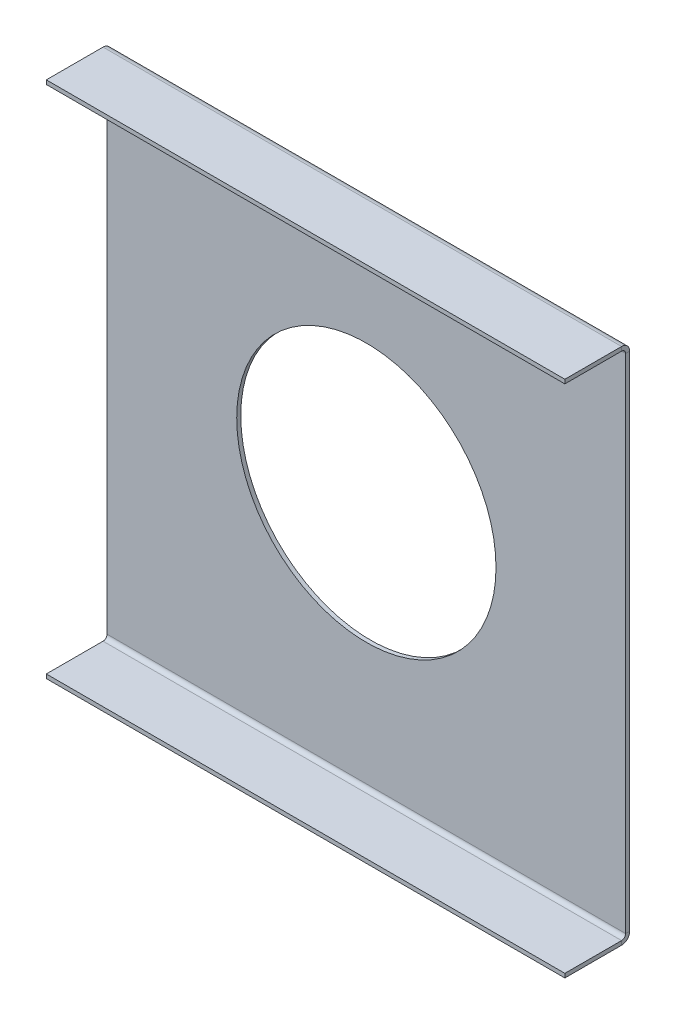
ISO-10303-21;
HEADER;
FILE_DESCRIPTION(('STEP AP214'),'2;1');
FILE_NAME('part.step','',(''),(''),'','','');
FILE_SCHEMA(('AUTOMOTIVE_DESIGN { 1 0 10303 214 1 1 1 1 }'));
ENDSEC;
DATA;
#1=APPLICATION_CONTEXT('core data for automotive mechanical design processes');
#2=APPLICATION_PROTOCOL_DEFINITION('international standard','automotive_design',2000,#1);
#3=PRODUCT_CONTEXT('',#1,'mechanical');
#4=PRODUCT('Part','Part','',(#3));
#5=PRODUCT_RELATED_PRODUCT_CATEGORY('part','',(#4));
#6=PRODUCT_DEFINITION_FORMATION('','',#4);
#7=PRODUCT_DEFINITION_CONTEXT('part definition',#1,'design');
#8=PRODUCT_DEFINITION('design','',#6,#7);
#9=PRODUCT_DEFINITION_SHAPE('','',#8);
#10=(LENGTH_UNIT() NAMED_UNIT(*) SI_UNIT(.MILLI.,.METRE.));
#11=(NAMED_UNIT(*) PLANE_ANGLE_UNIT() SI_UNIT($,.RADIAN.));
#12=(NAMED_UNIT(*) SI_UNIT($,.STERADIAN.) SOLID_ANGLE_UNIT());
#13=UNCERTAINTY_MEASURE_WITH_UNIT(LENGTH_MEASURE(1.E-05),#10,'distance_accuracy_value','');
#14=(GEOMETRIC_REPRESENTATION_CONTEXT(3) GLOBAL_UNCERTAINTY_ASSIGNED_CONTEXT((#13)) GLOBAL_UNIT_ASSIGNED_CONTEXT((#10,
#11,#12)) REPRESENTATION_CONTEXT('',''));
#15=CARTESIAN_POINT('',(0.,0.,0.));
#16=DIRECTION('',(0.,0.,1.));
#17=DIRECTION('',(1.,0.,0.));
#18=AXIS2_PLACEMENT_3D('',#15,#16,#17);
#19=CARTESIAN_POINT('',(0.,0.,0.));
#20=DIRECTION('',(0.,0.,1.));
#21=DIRECTION('',(1.,0.,0.));
#22=AXIS2_PLACEMENT_3D('',#19,#20,#21);
#23=PLANE('',#22);
#24=CARTESIAN_POINT('',(101.6,101.975799724417,0.));
#25=DIRECTION('',(0.,0.,-1.));
#26=DIRECTION('',(-1.,0.,0.));
#27=AXIS2_PLACEMENT_3D('',#24,#25,#26);
#28=CIRCLE('',#27,50.8);
#29=CARTESIAN_POINT('',(50.8,101.975799724417,0.));
#30=VERTEX_POINT('',#29);
#31=EDGE_CURVE('E341',#30,#30,#28,.T.);
#32=ORIENTED_EDGE('',*,*,#31,.F.);
#33=EDGE_LOOP('',(#32));
#34=FACE_BOUND('',#33,.T.);
#35=DIRECTION('',(1.,0.,0.));
#36=VECTOR('',#35,1.);
#37=CARTESIAN_POINT('',(203.2,3.17499999999999,0.));
#38=LINE('',#37,#36);
#39=CARTESIAN_POINT('',(203.2,3.17499999999999,0.));
#40=VERTEX_POINT('',#39);
#41=CARTESIAN_POINT('',(0.,3.17500000000001,0.));
#42=VERTEX_POINT('',#41);
#43=EDGE_CURVE('E230',#40,#42,#38,.F.);
#44=ORIENTED_EDGE('',*,*,#43,.T.);
#45=DIRECTION('',(0.,1.,0.));
#46=VECTOR('',#45,1.);
#47=CARTESIAN_POINT('',(0.,0.,0.));
#48=LINE('',#47,#46);
#49=CARTESIAN_POINT('',(0.,200.025,0.));
#50=VERTEX_POINT('',#49);
#51=EDGE_CURVE('E97',#42,#50,#48,.T.);
#52=ORIENTED_EDGE('',*,*,#51,.T.);
#53=DIRECTION('',(-1.,0.,0.));
#54=VECTOR('',#53,1.);
#55=CARTESIAN_POINT('',(0.,200.025,0.));
#56=LINE('',#55,#54);
#57=CARTESIAN_POINT('',(203.2,200.025,0.));
#58=VERTEX_POINT('',#57);
#59=EDGE_CURVE('E303',#50,#58,#56,.F.);
#60=ORIENTED_EDGE('',*,*,#59,.T.);
#61=DIRECTION('',(0.,1.,0.));
#62=VECTOR('',#61,1.);
#63=CARTESIAN_POINT('',(203.2,0.,0.));
#64=LINE('',#63,#62);
#65=EDGE_CURVE('E13',#40,#58,#64,.T.);
#66=ORIENTED_EDGE('',*,*,#65,.F.);
#67=EDGE_LOOP('',(#44,#52,#60,#66));
#68=FACE_BOUND('',#67,.T.);
#69=ADVANCED_FACE('F87',(#34,#68),#23,.F.);
#70=CARTESIAN_POINT('',(0.,0.,1.5875));
#71=DIRECTION('',(0.,0.,1.));
#72=DIRECTION('',(1.,0.,0.));
#73=AXIS2_PLACEMENT_3D('',#70,#71,#72);
#74=PLANE('',#73);
#75=CARTESIAN_POINT('',(101.6,101.975799724417,1.5875));
#76=DIRECTION('',(0.,0.,1.));
#77=DIRECTION('',(1.,0.,0.));
#78=AXIS2_PLACEMENT_3D('',#75,#76,#77);
#79=CIRCLE('',#78,50.8);
#80=CARTESIAN_POINT('',(152.4,101.975799724417,1.5875));
#81=VERTEX_POINT('',#80);
#82=EDGE_CURVE('E91',#81,#81,#79,.T.);
#83=ORIENTED_EDGE('',*,*,#82,.F.);
#84=EDGE_LOOP('',(#83));
#85=FACE_BOUND('',#84,.T.);
#86=DIRECTION('',(0.,1.,0.));
#87=VECTOR('',#86,1.);
#88=CARTESIAN_POINT('',(0.,0.,1.5875));
#89=LINE('',#88,#87);
#90=CARTESIAN_POINT('',(0.,3.17499999999999,1.5875));
#91=VERTEX_POINT('',#90);
#92=CARTESIAN_POINT('',(0.,200.025,1.5875));
#93=VERTEX_POINT('',#92);
#94=EDGE_CURVE('E105',#91,#93,#89,.T.);
#95=ORIENTED_EDGE('',*,*,#94,.F.);
#96=DIRECTION('',(1.,0.,0.));
#97=VECTOR('',#96,1.);
#98=CARTESIAN_POINT('',(203.2,3.17499999999999,1.5875));
#99=LINE('',#98,#97);
#100=CARTESIAN_POINT('',(203.2,3.17499999999999,1.5875));
#101=VERTEX_POINT('',#100);
#102=EDGE_CURVE('E246',#101,#91,#99,.F.);
#103=ORIENTED_EDGE('',*,*,#102,.F.);
#104=DIRECTION('',(0.,1.,0.));
#105=VECTOR('',#104,1.);
#106=CARTESIAN_POINT('',(203.2,0.,1.5875));
#107=LINE('',#106,#105);
#108=CARTESIAN_POINT('',(203.2,200.025,1.5875));
#109=VERTEX_POINT('',#108);
#110=EDGE_CURVE('E334',#101,#109,#107,.T.);
#111=ORIENTED_EDGE('',*,*,#110,.T.);
#112=DIRECTION('',(-1.,0.,0.));
#113=VECTOR('',#112,1.);
#114=CARTESIAN_POINT('',(0.,200.025,1.5875));
#115=LINE('',#114,#113);
#116=EDGE_CURVE('E319',#93,#109,#115,.F.);
#117=ORIENTED_EDGE('',*,*,#116,.F.);
#118=EDGE_LOOP('',(#95,#103,#111,#117));
#119=FACE_BOUND('',#118,.T.);
#120=ADVANCED_FACE('F352',(#85,#119),#74,.T.);
#121=CARTESIAN_POINT('',(203.2,0.,0.));
#122=DIRECTION('',(1.,0.,0.));
#123=DIRECTION('',(0.,1.,0.));
#124=AXIS2_PLACEMENT_3D('',#121,#122,#123);
#125=PLANE('',#124);
#126=ORIENTED_EDGE('',*,*,#110,.F.);
#127=DIRECTION('',(0.,0.,-1.));
#128=VECTOR('',#127,1.);
#129=CARTESIAN_POINT('',(203.2,3.17499999999999,1.5875));
#130=LINE('',#129,#128);
#131=EDGE_CURVE('E238',#101,#40,#130,.T.);
#132=ORIENTED_EDGE('',*,*,#131,.T.);
#133=ORIENTED_EDGE('',*,*,#65,.T.);
#134=DIRECTION('',(0.,0.,-1.));
#135=VECTOR('',#134,1.);
#136=CARTESIAN_POINT('',(203.2,200.025,1.5875));
#137=LINE('',#136,#135);
#138=EDGE_CURVE('E326',#109,#58,#137,.T.);
#139=ORIENTED_EDGE('',*,*,#138,.F.);
#140=EDGE_LOOP('',(#126,#132,#133,#139));
#141=FACE_BOUND('',#140,.T.);
#142=ADVANCED_FACE('F355',(#141),#125,.T.);
#143=CARTESIAN_POINT('',(0.,0.,0.));
#144=DIRECTION('',(1.,0.,0.));
#145=DIRECTION('',(0.,1.,0.));
#146=AXIS2_PLACEMENT_3D('',#143,#144,#145);
#147=PLANE('',#146);
#148=DIRECTION('',(0.,0.,-1.));
#149=VECTOR('',#148,1.);
#150=CARTESIAN_POINT('',(0.,3.17499999999999,1.5875));
#151=LINE('',#150,#149);
#152=EDGE_CURVE('E254',#91,#42,#151,.T.);
#153=ORIENTED_EDGE('',*,*,#152,.F.);
#154=ORIENTED_EDGE('',*,*,#94,.T.);
#155=DIRECTION('',(0.,0.,-1.));
#156=VECTOR('',#155,1.);
#157=CARTESIAN_POINT('',(0.,200.025,1.5875));
#158=LINE('',#157,#156);
#159=EDGE_CURVE('E311',#93,#50,#158,.T.);
#160=ORIENTED_EDGE('',*,*,#159,.T.);
#161=ORIENTED_EDGE('',*,*,#51,.F.);
#162=EDGE_LOOP('',(#153,#154,#160,#161));
#163=FACE_BOUND('',#162,.T.);
#164=ADVANCED_FACE('F89',(#163),#147,.F.);
#165=CARTESIAN_POINT('',(203.2,200.025,3.17499999999999));
#166=DIRECTION('',(1.,0.,0.));
#167=DIRECTION('',(0.,0.,-1.));
#168=AXIS2_PLACEMENT_3D('',#165,#166,#167);
#169=PLANE('',#168);
#170=DIRECTION('',(0.,-1.,0.));
#171=VECTOR('',#170,1.);
#172=CARTESIAN_POINT('',(203.2,203.2,3.17499999999998));
#173=LINE('',#172,#171);
#174=CARTESIAN_POINT('',(203.2,201.6125,3.17499999999998));
#175=VERTEX_POINT('',#174);
#176=CARTESIAN_POINT('',(203.2,203.2,3.17499999999998));
#177=VERTEX_POINT('',#176);
#178=EDGE_CURVE('E258',#175,#177,#173,.F.);
#179=ORIENTED_EDGE('',*,*,#178,.F.);
#180=CARTESIAN_POINT('',(203.2,200.025,3.17499999999999));
#181=DIRECTION('',(-1.,0.,0.));
#182=DIRECTION('',(0.,0.,1.));
#183=AXIS2_PLACEMENT_3D('',#180,#181,#182);
#184=CIRCLE('',#183,1.58749999999999);
#185=EDGE_CURVE('E315',#109,#175,#184,.F.);
#186=ORIENTED_EDGE('',*,*,#185,.F.);
#187=ORIENTED_EDGE('',*,*,#138,.T.);
#188=CARTESIAN_POINT('',(203.2,200.025,3.17499999999999));
#189=DIRECTION('',(-1.,0.,0.));
#190=DIRECTION('',(0.,0.,1.));
#191=AXIS2_PLACEMENT_3D('',#188,#189,#190);
#192=CIRCLE('',#191,3.17499999999999);
#193=EDGE_CURVE('E306',#58,#177,#192,.F.);
#194=ORIENTED_EDGE('',*,*,#193,.T.);
#195=EDGE_LOOP('',(#179,#186,#187,#194));
#196=FACE_BOUND('',#195,.T.);
#197=ADVANCED_FACE('F386',(#196),#169,.T.);
#198=CARTESIAN_POINT('',(0.,200.025,3.17499999999999));
#199=DIRECTION('',(1.,0.,0.));
#200=DIRECTION('',(0.,0.,-1.));
#201=AXIS2_PLACEMENT_3D('',#198,#199,#200);
#202=PLANE('',#201);
#203=CARTESIAN_POINT('',(0.,200.025,3.17499999999999));
#204=DIRECTION('',(-1.,0.,0.));
#205=DIRECTION('',(0.,0.,1.));
#206=AXIS2_PLACEMENT_3D('',#203,#204,#205);
#207=CIRCLE('',#206,1.58749999999999);
#208=CARTESIAN_POINT('',(0.,201.6125,3.17499999999998));
#209=VERTEX_POINT('',#208);
#210=EDGE_CURVE('E265',#209,#93,#207,.T.);
#211=ORIENTED_EDGE('',*,*,#210,.F.);
#212=DIRECTION('',(0.,-1.,0.));
#213=VECTOR('',#212,1.);
#214=CARTESIAN_POINT('',(0.,201.6125,3.17499999999998));
#215=LINE('',#214,#213);
#216=CARTESIAN_POINT('',(0.,203.2,3.17499999999998));
#217=VERTEX_POINT('',#216);
#218=EDGE_CURVE('E293',#209,#217,#215,.F.);
#219=ORIENTED_EDGE('',*,*,#218,.T.);
#220=CARTESIAN_POINT('',(0.,200.025,3.17499999999999));
#221=DIRECTION('',(-1.,0.,0.));
#222=DIRECTION('',(0.,0.,1.));
#223=AXIS2_PLACEMENT_3D('',#220,#221,#222);
#224=CIRCLE('',#223,3.17499999999999);
#225=EDGE_CURVE('E307',#217,#50,#224,.T.);
#226=ORIENTED_EDGE('',*,*,#225,.T.);
#227=ORIENTED_EDGE('',*,*,#159,.F.);
#228=EDGE_LOOP('',(#211,#219,#226,#227));
#229=FACE_BOUND('',#228,.T.);
#230=ADVANCED_FACE('F406',(#229),#202,.F.);
#231=CARTESIAN_POINT('',(0.,200.025,3.17499999999999));
#232=DIRECTION('',(-1.,0.,0.));
#233=DIRECTION('',(0.,1.,0.));
#234=AXIS2_PLACEMENT_3D('',#231,#232,#233);
#235=CYLINDRICAL_SURFACE('',#234,3.17499999999999);
#236=ORIENTED_EDGE('',*,*,#59,.F.);
#237=ORIENTED_EDGE('',*,*,#225,.F.);
#238=DIRECTION('',(-1.,0.,0.));
#239=VECTOR('',#238,1.);
#240=CARTESIAN_POINT('',(203.2,203.2,3.17499999999998));
#241=LINE('',#240,#239);
#242=EDGE_CURVE('E290',#217,#177,#241,.F.);
#243=ORIENTED_EDGE('',*,*,#242,.T.);
#244=ORIENTED_EDGE('',*,*,#193,.F.);
#245=EDGE_LOOP('',(#236,#237,#243,#244));
#246=FACE_BOUND('',#245,.T.);
#247=ADVANCED_FACE('F416',(#246),#235,.T.);
#248=CARTESIAN_POINT('',(0.,200.025,3.17499999999999));
#249=DIRECTION('',(-1.,0.,0.));
#250=DIRECTION('',(0.,1.,0.));
#251=AXIS2_PLACEMENT_3D('',#248,#249,#250);
#252=CYLINDRICAL_SURFACE('',#251,1.58749999999999);
#253=ORIENTED_EDGE('',*,*,#116,.T.);
#254=ORIENTED_EDGE('',*,*,#185,.T.);
#255=DIRECTION('',(-1.,0.,0.));
#256=VECTOR('',#255,1.);
#257=CARTESIAN_POINT('',(203.2,201.6125,3.17499999999998));
#258=LINE('',#257,#256);
#259=EDGE_CURVE('E297',#175,#209,#258,.T.);
#260=ORIENTED_EDGE('',*,*,#259,.T.);
#261=ORIENTED_EDGE('',*,*,#210,.T.);
#262=EDGE_LOOP('',(#253,#254,#260,#261));
#263=FACE_BOUND('',#262,.T.);
#264=ADVANCED_FACE('F383',(#263),#252,.F.);
#265=CARTESIAN_POINT('',(0.,203.2,25.4));
#266=DIRECTION('',(1.,0.,0.));
#267=DIRECTION('',(0.,0.,-1.));
#268=AXIS2_PLACEMENT_3D('',#265,#266,#267);
#269=PLANE('',#268);
#270=ORIENTED_EDGE('',*,*,#218,.F.);
#271=DIRECTION('',(0.,0.,-1.));
#272=VECTOR('',#271,1.);
#273=CARTESIAN_POINT('',(0.,201.6125,25.4));
#274=LINE('',#273,#272);
#275=CARTESIAN_POINT('',(0.,201.6125,25.4));
#276=VERTEX_POINT('',#275);
#277=EDGE_CURVE('E287',#209,#276,#274,.F.);
#278=ORIENTED_EDGE('',*,*,#277,.T.);
#279=DIRECTION('',(0.,-1.,0.));
#280=VECTOR('',#279,1.);
#281=CARTESIAN_POINT('',(0.,203.2,25.4));
#282=LINE('',#281,#280);
#283=CARTESIAN_POINT('',(0.,203.2,25.4));
#284=VERTEX_POINT('',#283);
#285=EDGE_CURVE('E261',#284,#276,#282,.T.);
#286=ORIENTED_EDGE('',*,*,#285,.F.);
#287=DIRECTION('',(0.,0.,1.));
#288=VECTOR('',#287,1.);
#289=CARTESIAN_POINT('',(0.,203.2,-7.16085462385513E-13));
#290=LINE('',#289,#288);
#291=EDGE_CURVE('E277',#217,#284,#290,.T.);
#292=ORIENTED_EDGE('',*,*,#291,.F.);
#293=EDGE_LOOP('',(#270,#278,#286,#292));
#294=FACE_BOUND('',#293,.T.);
#295=ADVANCED_FACE('F408',(#294),#269,.F.);
#296=CARTESIAN_POINT('',(203.2,203.2,1.58749999999999));
#297=DIRECTION('',(-1.,0.,0.));
#298=DIRECTION('',(0.,0.,1.));
#299=AXIS2_PLACEMENT_3D('',#296,#297,#298);
#300=PLANE('',#299);
#301=ORIENTED_EDGE('',*,*,#178,.T.);
#302=DIRECTION('',(0.,0.,-1.));
#303=VECTOR('',#302,1.);
#304=CARTESIAN_POINT('',(203.2,203.2,-7.16085462385513E-13));
#305=LINE('',#304,#303);
#306=CARTESIAN_POINT('',(203.2,203.2,25.4));
#307=VERTEX_POINT('',#306);
#308=EDGE_CURVE('E270',#307,#177,#305,.T.);
#309=ORIENTED_EDGE('',*,*,#308,.F.);
#310=DIRECTION('',(0.,-1.,0.));
#311=VECTOR('',#310,1.);
#312=CARTESIAN_POINT('',(203.2,203.2,25.4));
#313=LINE('',#312,#311);
#314=CARTESIAN_POINT('',(203.2,201.6125,25.4));
#315=VERTEX_POINT('',#314);
#316=EDGE_CURVE('E266',#307,#315,#313,.T.);
#317=ORIENTED_EDGE('',*,*,#316,.T.);
#318=DIRECTION('',(0.,0.,1.));
#319=VECTOR('',#318,1.);
#320=CARTESIAN_POINT('',(203.2,201.6125,1.5875));
#321=LINE('',#320,#319);
#322=EDGE_CURVE('E280',#315,#175,#321,.F.);
#323=ORIENTED_EDGE('',*,*,#322,.T.);
#324=EDGE_LOOP('',(#301,#309,#317,#323));
#325=FACE_BOUND('',#324,.T.);
#326=ADVANCED_FACE('F389',(#325),#300,.F.);
#327=CARTESIAN_POINT('',(0.,203.2,-7.16085462385513E-13));
#328=DIRECTION('',(0.,-1.,0.));
#329=DIRECTION('',(0.,0.,-1.));
#330=AXIS2_PLACEMENT_3D('',#327,#328,#329);
#331=PLANE('',#330);
#332=ORIENTED_EDGE('',*,*,#242,.F.);
#333=ORIENTED_EDGE('',*,*,#291,.T.);
#334=DIRECTION('',(1.,0.,0.));
#335=VECTOR('',#334,1.);
#336=CARTESIAN_POINT('',(0.,203.2,25.4));
#337=LINE('',#336,#335);
#338=EDGE_CURVE('E274',#284,#307,#337,.T.);
#339=ORIENTED_EDGE('',*,*,#338,.T.);
#340=ORIENTED_EDGE('',*,*,#308,.T.);
#341=EDGE_LOOP('',(#332,#333,#339,#340));
#342=FACE_BOUND('',#341,.T.);
#343=ADVANCED_FACE('F393',(#342),#331,.F.);
#344=CARTESIAN_POINT('',(0.,201.6125,-7.105427357601E-13));
#345=DIRECTION('',(0.,-1.,0.));
#346=DIRECTION('',(0.,0.,-1.));
#347=AXIS2_PLACEMENT_3D('',#344,#345,#346);
#348=PLANE('',#347);
#349=ORIENTED_EDGE('',*,*,#277,.F.);
#350=ORIENTED_EDGE('',*,*,#259,.F.);
#351=ORIENTED_EDGE('',*,*,#322,.F.);
#352=DIRECTION('',(-1.,0.,0.));
#353=VECTOR('',#352,1.);
#354=CARTESIAN_POINT('',(203.2,201.6125,25.4));
#355=LINE('',#354,#353);
#356=EDGE_CURVE('E284',#276,#315,#355,.F.);
#357=ORIENTED_EDGE('',*,*,#356,.F.);
#358=EDGE_LOOP('',(#349,#350,#351,#357));
#359=FACE_BOUND('',#358,.T.);
#360=ADVANCED_FACE('F403',(#359),#348,.T.);
#361=CARTESIAN_POINT('',(203.2,203.2,25.4));
#362=DIRECTION('',(0.,0.,-1.));
#363=DIRECTION('',(0.,1.,0.));
#364=AXIS2_PLACEMENT_3D('',#361,#362,#363);
#365=PLANE('',#364);
#366=ORIENTED_EDGE('',*,*,#356,.T.);
#367=ORIENTED_EDGE('',*,*,#316,.F.);
#368=ORIENTED_EDGE('',*,*,#338,.F.);
#369=ORIENTED_EDGE('',*,*,#285,.T.);
#370=EDGE_LOOP('',(#366,#367,#368,#369));
#371=FACE_BOUND('',#370,.T.);
#372=ADVANCED_FACE('F399',(#371),#365,.F.);
#373=CARTESIAN_POINT('',(0.,3.17499999999999,3.175));
#374=DIRECTION('',(-1.,0.,0.));
#375=DIRECTION('',(0.,0.,1.));
#376=AXIS2_PLACEMENT_3D('',#373,#374,#375);
#377=PLANE('',#376);
#378=DIRECTION('',(0.,1.,0.));
#379=VECTOR('',#378,1.);
#380=CARTESIAN_POINT('',(0.,0.,3.17499999999999));
#381=LINE('',#380,#379);
#382=CARTESIAN_POINT('',(0.,1.58749999999999,3.17499999999999));
#383=VERTEX_POINT('',#382);
#384=CARTESIAN_POINT('',(1.11022302462516E-13,0.,3.17499999999999));
#385=VERTEX_POINT('',#384);
#386=EDGE_CURVE('E204',#383,#385,#381,.F.);
#387=ORIENTED_EDGE('',*,*,#386,.F.);
#388=CARTESIAN_POINT('',(0.,3.17499999999999,3.175));
#389=DIRECTION('',(1.,0.,0.));
#390=DIRECTION('',(0.,0.,-1.));
#391=AXIS2_PLACEMENT_3D('',#388,#389,#390);
#392=CIRCLE('',#391,1.5875);
#393=EDGE_CURVE('E242',#91,#383,#392,.F.);
#394=ORIENTED_EDGE('',*,*,#393,.F.);
#395=ORIENTED_EDGE('',*,*,#152,.T.);
#396=CARTESIAN_POINT('',(1.11022302462516E-13,3.17499999999999,3.175));
#397=DIRECTION('',(1.,0.,0.));
#398=DIRECTION('',(0.,0.,-1.));
#399=AXIS2_PLACEMENT_3D('',#396,#397,#398);
#400=CIRCLE('',#399,3.175);
#401=EDGE_CURVE('E233',#42,#385,#400,.F.);
#402=ORIENTED_EDGE('',*,*,#401,.T.);
#403=EDGE_LOOP('',(#387,#394,#395,#402));
#404=FACE_BOUND('',#403,.T.);
#405=ADVANCED_FACE('F365',(#404),#377,.T.);
#406=CARTESIAN_POINT('',(203.2,3.17499999999999,3.175));
#407=DIRECTION('',(-1.,0.,0.));
#408=DIRECTION('',(0.,0.,1.));
#409=AXIS2_PLACEMENT_3D('',#406,#407,#408);
#410=PLANE('',#409);
#411=CARTESIAN_POINT('',(203.2,3.17499999999999,3.175));
#412=DIRECTION('',(1.,0.,0.));
#413=DIRECTION('',(0.,0.,-1.));
#414=AXIS2_PLACEMENT_3D('',#411,#412,#413);
#415=CIRCLE('',#414,1.5875);
#416=CARTESIAN_POINT('',(203.2,1.58749999999999,3.17499999999999));
#417=VERTEX_POINT('',#416);
#418=EDGE_CURVE('E250',#417,#101,#415,.T.);
#419=ORIENTED_EDGE('',*,*,#418,.F.);
#420=DIRECTION('',(0.,1.,0.));
#421=VECTOR('',#420,1.);
#422=CARTESIAN_POINT('',(203.2,1.58749999999999,3.17499999999999));
#423=LINE('',#422,#421);
#424=CARTESIAN_POINT('',(203.2,0.,3.17499999999999));
#425=VERTEX_POINT('',#424);
#426=EDGE_CURVE('E221',#417,#425,#423,.F.);
#427=ORIENTED_EDGE('',*,*,#426,.T.);
#428=CARTESIAN_POINT('',(203.2,3.17499999999999,3.175));
#429=DIRECTION('',(1.,0.,0.));
#430=DIRECTION('',(0.,0.,-1.));
#431=AXIS2_PLACEMENT_3D('',#428,#429,#430);
#432=CIRCLE('',#431,3.175);
#433=EDGE_CURVE('E234',#425,#40,#432,.T.);
#434=ORIENTED_EDGE('',*,*,#433,.T.);
#435=ORIENTED_EDGE('',*,*,#131,.F.);
#436=EDGE_LOOP('',(#419,#427,#434,#435));
#437=FACE_BOUND('',#436,.T.);
#438=ADVANCED_FACE('F378',(#437),#410,.F.);
#439=CARTESIAN_POINT('',(203.2,3.17499999999999,3.175));
#440=DIRECTION('',(1.,0.,0.));
#441=DIRECTION('',(0.,-1.,0.));
#442=AXIS2_PLACEMENT_3D('',#439,#440,#441);
#443=CYLINDRICAL_SURFACE('',#442,3.175);
#444=ORIENTED_EDGE('',*,*,#43,.F.);
#445=ORIENTED_EDGE('',*,*,#433,.F.);
#446=DIRECTION('',(1.,0.,0.));
#447=VECTOR('',#446,1.);
#448=CARTESIAN_POINT('',(0.,0.,3.17499999999999));
#449=LINE('',#448,#447);
#450=EDGE_CURVE('E218',#425,#385,#449,.F.);
#451=ORIENTED_EDGE('',*,*,#450,.T.);
#452=ORIENTED_EDGE('',*,*,#401,.F.);
#453=EDGE_LOOP('',(#444,#445,#451,#452));
#454=FACE_BOUND('',#453,.T.);
#455=ADVANCED_FACE('F369',(#454),#443,.T.);
#456=CARTESIAN_POINT('',(203.2,3.17499999999999,3.175));
#457=DIRECTION('',(1.,0.,0.));
#458=DIRECTION('',(0.,-1.,0.));
#459=AXIS2_PLACEMENT_3D('',#456,#457,#458);
#460=CYLINDRICAL_SURFACE('',#459,1.5875);
#461=ORIENTED_EDGE('',*,*,#102,.T.);
#462=ORIENTED_EDGE('',*,*,#393,.T.);
#463=DIRECTION('',(1.,0.,0.));
#464=VECTOR('',#463,1.);
#465=CARTESIAN_POINT('',(0.,1.58749999999999,3.17499999999999));
#466=LINE('',#465,#464);
#467=EDGE_CURVE('E225',#383,#417,#466,.T.);
#468=ORIENTED_EDGE('',*,*,#467,.T.);
#469=ORIENTED_EDGE('',*,*,#418,.T.);
#470=EDGE_LOOP('',(#461,#462,#468,#469));
#471=FACE_BOUND('',#470,.T.);
#472=ADVANCED_FACE('F361',(#471),#460,.F.);
#473=CARTESIAN_POINT('',(0.,0.,1.58749999999999));
#474=DIRECTION('',(1.,0.,0.));
#475=DIRECTION('',(0.,0.,-1.));
#476=AXIS2_PLACEMENT_3D('',#473,#474,#475);
#477=PLANE('',#476);
#478=ORIENTED_EDGE('',*,*,#386,.T.);
#479=DIRECTION('',(0.,0.,-1.));
#480=VECTOR('',#479,1.);
#481=CARTESIAN_POINT('',(0.,0.,0.));
#482=LINE('',#481,#480);
#483=CARTESIAN_POINT('',(0.,0.,25.4));
#484=VERTEX_POINT('',#483);
#485=EDGE_CURVE('E183',#484,#385,#482,.T.);
#486=ORIENTED_EDGE('',*,*,#485,.F.);
#487=DIRECTION('',(0.,1.,0.));
#488=VECTOR('',#487,1.);
#489=CARTESIAN_POINT('',(0.,0.,25.4));
#490=LINE('',#489,#488);
#491=CARTESIAN_POINT('',(0.,1.58749999999992,25.4));
#492=VERTEX_POINT('',#491);
#493=EDGE_CURVE('E190',#484,#492,#490,.T.);
#494=ORIENTED_EDGE('',*,*,#493,.T.);
#495=DIRECTION('',(0.,0.,1.));
#496=VECTOR('',#495,1.);
#497=CARTESIAN_POINT('',(0.,1.5875,1.5875));
#498=LINE('',#497,#496);
#499=EDGE_CURVE('E215',#492,#383,#498,.F.);
#500=ORIENTED_EDGE('',*,*,#499,.T.);
#501=EDGE_LOOP('',(#478,#486,#494,#500));
#502=FACE_BOUND('',#501,.T.);
#503=ADVANCED_FACE('F203',(#502),#477,.F.);
#504=CARTESIAN_POINT('',(203.2,0.,25.4));
#505=DIRECTION('',(-1.,0.,0.));
#506=DIRECTION('',(0.,0.,1.));
#507=AXIS2_PLACEMENT_3D('',#504,#505,#506);
#508=PLANE('',#507);
#509=ORIENTED_EDGE('',*,*,#426,.F.);
#510=DIRECTION('',(0.,0.,-1.));
#511=VECTOR('',#510,1.);
#512=CARTESIAN_POINT('',(203.2,1.58749999999992,25.4));
#513=LINE('',#512,#511);
#514=CARTESIAN_POINT('',(203.2,1.58749999999992,25.4));
#515=VERTEX_POINT('',#514);
#516=EDGE_CURVE('E210',#417,#515,#513,.F.);
#517=ORIENTED_EDGE('',*,*,#516,.T.);
#518=DIRECTION('',(0.,1.,0.));
#519=VECTOR('',#518,1.);
#520=CARTESIAN_POINT('',(203.2,0.,25.4));
#521=LINE('',#520,#519);
#522=CARTESIAN_POINT('',(203.2,0.,25.4));
#523=VERTEX_POINT('',#522);
#524=EDGE_CURVE('E200',#523,#515,#521,.T.);
#525=ORIENTED_EDGE('',*,*,#524,.F.);
#526=DIRECTION('',(0.,0.,1.));
#527=VECTOR('',#526,1.);
#528=CARTESIAN_POINT('',(203.2,0.,0.));
#529=LINE('',#528,#527);
#530=EDGE_CURVE('E185',#425,#523,#529,.T.);
#531=ORIENTED_EDGE('',*,*,#530,.F.);
#532=EDGE_LOOP('',(#509,#517,#525,#531));
#533=FACE_BOUND('',#532,.T.);
#534=ADVANCED_FACE('F372',(#533),#508,.F.);
#535=CARTESIAN_POINT('',(0.,0.,0.));
#536=DIRECTION('',(0.,1.,0.));
#537=DIRECTION('',(0.,0.,1.));
#538=AXIS2_PLACEMENT_3D('',#535,#536,#537);
#539=PLANE('',#538);
#540=ORIENTED_EDGE('',*,*,#450,.F.);
#541=ORIENTED_EDGE('',*,*,#530,.T.);
#542=DIRECTION('',(-1.,0.,0.));
#543=VECTOR('',#542,1.);
#544=CARTESIAN_POINT('',(0.,0.,25.4));
#545=LINE('',#544,#543);
#546=EDGE_CURVE('E178',#523,#484,#545,.T.);
#547=ORIENTED_EDGE('',*,*,#546,.T.);
#548=ORIENTED_EDGE('',*,*,#485,.T.);
#549=EDGE_LOOP('',(#540,#541,#547,#548));
#550=FACE_BOUND('',#549,.T.);
#551=ADVANCED_FACE('F181',(#550),#539,.F.);
#552=CARTESIAN_POINT('',(0.,1.58750000000001,0.));
#553=DIRECTION('',(0.,1.,0.));
#554=DIRECTION('',(0.,0.,1.));
#555=AXIS2_PLACEMENT_3D('',#552,#553,#554);
#556=PLANE('',#555);
#557=ORIENTED_EDGE('',*,*,#516,.F.);
#558=ORIENTED_EDGE('',*,*,#467,.F.);
#559=ORIENTED_EDGE('',*,*,#499,.F.);
#560=DIRECTION('',(1.,0.,0.));
#561=VECTOR('',#560,1.);
#562=CARTESIAN_POINT('',(0.,1.58749999999992,25.4));
#563=LINE('',#562,#561);
#564=EDGE_CURVE('E195',#515,#492,#563,.F.);
#565=ORIENTED_EDGE('',*,*,#564,.F.);
#566=EDGE_LOOP('',(#557,#558,#559,#565));
#567=FACE_BOUND('',#566,.T.);
#568=ADVANCED_FACE('F375',(#567),#556,.T.);
#569=CARTESIAN_POINT('',(0.,0.,25.4));
#570=DIRECTION('',(0.,0.,-1.));
#571=DIRECTION('',(0.,1.,0.));
#572=AXIS2_PLACEMENT_3D('',#569,#570,#571);
#573=PLANE('',#572);
#574=ORIENTED_EDGE('',*,*,#564,.T.);
#575=ORIENTED_EDGE('',*,*,#493,.F.);
#576=ORIENTED_EDGE('',*,*,#546,.F.);
#577=ORIENTED_EDGE('',*,*,#524,.T.);
#578=EDGE_LOOP('',(#574,#575,#576,#577));
#579=FACE_BOUND('',#578,.T.);
#580=ADVANCED_FACE('F193',(#579),#573,.F.);
#581=CARTESIAN_POINT('',(101.6,101.975799724417,2.54));
#582=DIRECTION('',(0.,0.,-1.));
#583=DIRECTION('',(-1.,0.,0.));
#584=AXIS2_PLACEMENT_3D('',#581,#582,#583);
#585=CYLINDRICAL_SURFACE('',#584,50.8);
#586=ORIENTED_EDGE('',*,*,#82,.T.);
#587=EDGE_LOOP('',(#586));
#588=FACE_BOUND('',#587,.T.);
#589=ORIENTED_EDGE('',*,*,#31,.T.);
#590=EDGE_LOOP('',(#589));
#591=FACE_BOUND('',#590,.T.);
#592=ADVANCED_FACE('F350',(#588,#591),#585,.F.);
#593=CLOSED_SHELL('',(#69,#120,#142,#164,#197,#230,#247,#264,#295,#326,#343,#360,#372,#405,#438,
#455,#472,#503,#534,#551,#568,#580,#592));
#594=MANIFOLD_SOLID_BREP('B2',#593);
#595=ADVANCED_BREP_SHAPE_REPRESENTATION('',(#18,#594),#14);
#596=SHAPE_DEFINITION_REPRESENTATION(#9,#595);
ENDSEC;
END-ISO-10303-21;
